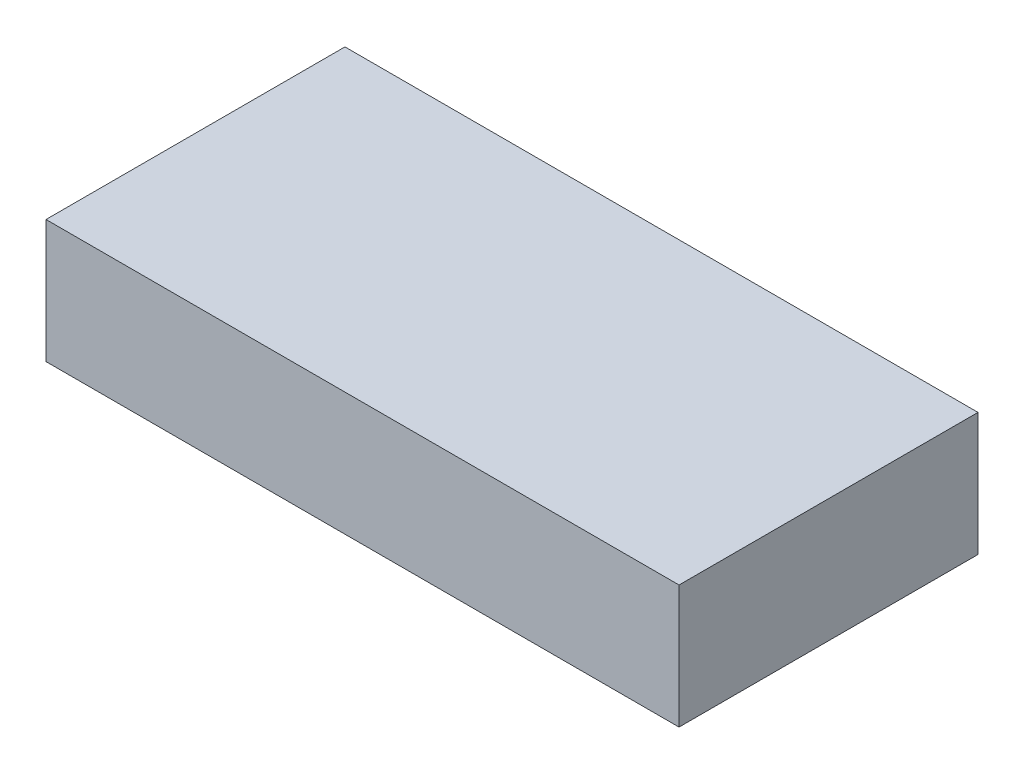
ISO-10303-21;
HEADER;
FILE_DESCRIPTION(('STEP AP214'),'2;1');
FILE_NAME('part.step','',(''),(''),'','','');
FILE_SCHEMA(('AUTOMOTIVE_DESIGN { 1 0 10303 214 1 1 1 1 }'));
ENDSEC;
DATA;
#1=APPLICATION_CONTEXT('core data for automotive mechanical design processes');
#2=APPLICATION_PROTOCOL_DEFINITION('international standard','automotive_design',2000,#1);
#3=PRODUCT_CONTEXT('',#1,'mechanical');
#4=PRODUCT('Part','Part','',(#3));
#5=PRODUCT_RELATED_PRODUCT_CATEGORY('part','',(#4));
#6=PRODUCT_DEFINITION_FORMATION('','',#4);
#7=PRODUCT_DEFINITION_CONTEXT('part definition',#1,'design');
#8=PRODUCT_DEFINITION('design','',#6,#7);
#9=PRODUCT_DEFINITION_SHAPE('','',#8);
#10=(LENGTH_UNIT() NAMED_UNIT(*) SI_UNIT(.MILLI.,.METRE.));
#11=(NAMED_UNIT(*) PLANE_ANGLE_UNIT() SI_UNIT($,.RADIAN.));
#12=(NAMED_UNIT(*) SI_UNIT($,.STERADIAN.) SOLID_ANGLE_UNIT());
#13=UNCERTAINTY_MEASURE_WITH_UNIT(LENGTH_MEASURE(1.E-05),#10,'distance_accuracy_value','');
#14=(GEOMETRIC_REPRESENTATION_CONTEXT(3) GLOBAL_UNCERTAINTY_ASSIGNED_CONTEXT((#13)) GLOBAL_UNIT_ASSIGNED_CONTEXT((#10,
#11,#12)) REPRESENTATION_CONTEXT('',''));
#15=CARTESIAN_POINT('',(0.,0.,0.));
#16=DIRECTION('',(0.,0.,1.));
#17=DIRECTION('',(1.,0.,0.));
#18=AXIS2_PLACEMENT_3D('',#15,#16,#17);
#19=CARTESIAN_POINT('',(0.,14.,0.));
#20=DIRECTION('',(1.,0.,0.));
#21=DIRECTION('',(0.,0.,-1.));
#22=AXIS2_PLACEMENT_3D('',#19,#20,#21);
#23=PLANE('',#22);
#24=DIRECTION('',(0.,0.,1.));
#25=VECTOR('',#24,1.);
#26=CARTESIAN_POINT('',(0.,0.,0.));
#27=LINE('',#26,#25);
#28=CARTESIAN_POINT('',(0.,0.,-34.));
#29=VERTEX_POINT('',#28);
#30=CARTESIAN_POINT('',(0.,0.,0.));
#31=VERTEX_POINT('',#30);
#32=EDGE_CURVE('E96',#29,#31,#27,.T.);
#33=ORIENTED_EDGE('',*,*,#32,.T.);
#34=DIRECTION('',(0.,-1.,0.));
#35=VECTOR('',#34,1.);
#36=CARTESIAN_POINT('',(0.,14.,0.));
#37=LINE('',#36,#35);
#38=CARTESIAN_POINT('',(0.,14.,0.));
#39=VERTEX_POINT('',#38);
#40=EDGE_CURVE('E11',#39,#31,#37,.T.);
#41=ORIENTED_EDGE('',*,*,#40,.F.);
#42=DIRECTION('',(0.,0.,1.));
#43=VECTOR('',#42,1.);
#44=CARTESIAN_POINT('',(0.,14.,0.));
#45=LINE('',#44,#43);
#46=CARTESIAN_POINT('',(0.,14.,-34.));
#47=VERTEX_POINT('',#46);
#48=EDGE_CURVE('E84',#47,#39,#45,.T.);
#49=ORIENTED_EDGE('',*,*,#48,.F.);
#50=DIRECTION('',(0.,-1.,0.));
#51=VECTOR('',#50,1.);
#52=CARTESIAN_POINT('',(0.,14.,-34.));
#53=LINE('',#52,#51);
#54=EDGE_CURVE('E92',#47,#29,#53,.T.);
#55=ORIENTED_EDGE('',*,*,#54,.T.);
#56=EDGE_LOOP('',(#33,#41,#49,#55));
#57=FACE_BOUND('',#56,.T.);
#58=ADVANCED_FACE('F33',(#57),#23,.F.);
#59=CARTESIAN_POINT('',(0.,14.,0.));
#60=DIRECTION('',(0.,0.,-1.));
#61=DIRECTION('',(-1.,0.,0.));
#62=AXIS2_PLACEMENT_3D('',#59,#60,#61);
#63=PLANE('',#62);
#64=DIRECTION('',(1.,0.,0.));
#65=VECTOR('',#64,1.);
#66=CARTESIAN_POINT('',(0.,0.,0.));
#67=LINE('',#66,#65);
#68=CARTESIAN_POINT('',(72.,0.,0.));
#69=VERTEX_POINT('',#68);
#70=EDGE_CURVE('E88',#31,#69,#67,.T.);
#71=ORIENTED_EDGE('',*,*,#70,.T.);
#72=DIRECTION('',(0.,-1.,0.));
#73=VECTOR('',#72,1.);
#74=CARTESIAN_POINT('',(72.,14.,0.));
#75=LINE('',#74,#73);
#76=CARTESIAN_POINT('',(72.,14.,0.));
#77=VERTEX_POINT('',#76);
#78=EDGE_CURVE('E41',#77,#69,#75,.T.);
#79=ORIENTED_EDGE('',*,*,#78,.F.);
#80=DIRECTION('',(1.,0.,0.));
#81=VECTOR('',#80,1.);
#82=CARTESIAN_POINT('',(0.,14.,0.));
#83=LINE('',#82,#81);
#84=EDGE_CURVE('E79',#39,#77,#83,.T.);
#85=ORIENTED_EDGE('',*,*,#84,.F.);
#86=ORIENTED_EDGE('',*,*,#40,.T.);
#87=EDGE_LOOP('',(#71,#79,#85,#86));
#88=FACE_BOUND('',#87,.T.);
#89=ADVANCED_FACE('F87',(#88),#63,.F.);
#90=CARTESIAN_POINT('',(72.,14.,0.));
#91=DIRECTION('',(-1.,0.,0.));
#92=DIRECTION('',(0.,0.,1.));
#93=AXIS2_PLACEMENT_3D('',#90,#91,#92);
#94=PLANE('',#93);
#95=DIRECTION('',(0.,0.,-1.));
#96=VECTOR('',#95,1.);
#97=CARTESIAN_POINT('',(72.,0.,0.));
#98=LINE('',#97,#96);
#99=CARTESIAN_POINT('',(72.,0.,-34.));
#100=VERTEX_POINT('',#99);
#101=EDGE_CURVE('E66',#69,#100,#98,.T.);
#102=ORIENTED_EDGE('',*,*,#101,.T.);
#103=DIRECTION('',(0.,-1.,0.));
#104=VECTOR('',#103,1.);
#105=CARTESIAN_POINT('',(72.,14.,-34.));
#106=LINE('',#105,#104);
#107=CARTESIAN_POINT('',(72.,14.,-34.));
#108=VERTEX_POINT('',#107);
#109=EDGE_CURVE('E89',#108,#100,#106,.T.);
#110=ORIENTED_EDGE('',*,*,#109,.F.);
#111=DIRECTION('',(0.,0.,-1.));
#112=VECTOR('',#111,1.);
#113=CARTESIAN_POINT('',(72.,14.,0.));
#114=LINE('',#113,#112);
#115=EDGE_CURVE('E82',#77,#108,#114,.T.);
#116=ORIENTED_EDGE('',*,*,#115,.F.);
#117=ORIENTED_EDGE('',*,*,#78,.T.);
#118=EDGE_LOOP('',(#102,#110,#116,#117));
#119=FACE_BOUND('',#118,.T.);
#120=ADVANCED_FACE('F90',(#119),#94,.F.);
#121=CARTESIAN_POINT('',(0.,14.,-34.));
#122=DIRECTION('',(0.,0.,1.));
#123=DIRECTION('',(1.,0.,0.));
#124=AXIS2_PLACEMENT_3D('',#121,#122,#123);
#125=PLANE('',#124);
#126=DIRECTION('',(-1.,0.,0.));
#127=VECTOR('',#126,1.);
#128=CARTESIAN_POINT('',(0.,0.,-34.));
#129=LINE('',#128,#127);
#130=EDGE_CURVE('E72',#100,#29,#129,.T.);
#131=ORIENTED_EDGE('',*,*,#130,.T.);
#132=ORIENTED_EDGE('',*,*,#54,.F.);
#133=DIRECTION('',(-1.,0.,0.));
#134=VECTOR('',#133,1.);
#135=CARTESIAN_POINT('',(0.,14.,-34.));
#136=LINE('',#135,#134);
#137=EDGE_CURVE('E49',#108,#47,#136,.T.);
#138=ORIENTED_EDGE('',*,*,#137,.F.);
#139=ORIENTED_EDGE('',*,*,#109,.T.);
#140=EDGE_LOOP('',(#131,#132,#138,#139));
#141=FACE_BOUND('',#140,.T.);
#142=ADVANCED_FACE('F103',(#141),#125,.F.);
#143=CARTESIAN_POINT('',(0.,14.,0.));
#144=DIRECTION('',(0.,-1.,0.));
#145=DIRECTION('',(0.,0.,-1.));
#146=AXIS2_PLACEMENT_3D('',#143,#144,#145);
#147=PLANE('',#146);
#148=ORIENTED_EDGE('',*,*,#48,.T.);
#149=ORIENTED_EDGE('',*,*,#84,.T.);
#150=ORIENTED_EDGE('',*,*,#115,.T.);
#151=ORIENTED_EDGE('',*,*,#137,.T.);
#152=EDGE_LOOP('',(#148,#149,#150,#151));
#153=FACE_BOUND('',#152,.T.);
#154=ADVANCED_FACE('F80',(#153),#147,.F.);
#155=CARTESIAN_POINT('',(0.,0.,0.));
#156=DIRECTION('',(0.,-1.,0.));
#157=DIRECTION('',(0.,0.,-1.));
#158=AXIS2_PLACEMENT_3D('',#155,#156,#157);
#159=PLANE('',#158);
#160=ORIENTED_EDGE('',*,*,#32,.F.);
#161=ORIENTED_EDGE('',*,*,#130,.F.);
#162=ORIENTED_EDGE('',*,*,#101,.F.);
#163=ORIENTED_EDGE('',*,*,#70,.F.);
#164=EDGE_LOOP('',(#160,#161,#162,#163));
#165=FACE_BOUND('',#164,.T.);
#166=ADVANCED_FACE('F106',(#165),#159,.T.);
#167=CLOSED_SHELL('',(#58,#89,#120,#142,#154,#166));
#168=MANIFOLD_SOLID_BREP('B2',#167);
#169=ADVANCED_BREP_SHAPE_REPRESENTATION('',(#18,#168),#14);
#170=SHAPE_DEFINITION_REPRESENTATION(#9,#169);
ENDSEC;
END-ISO-10303-21;
